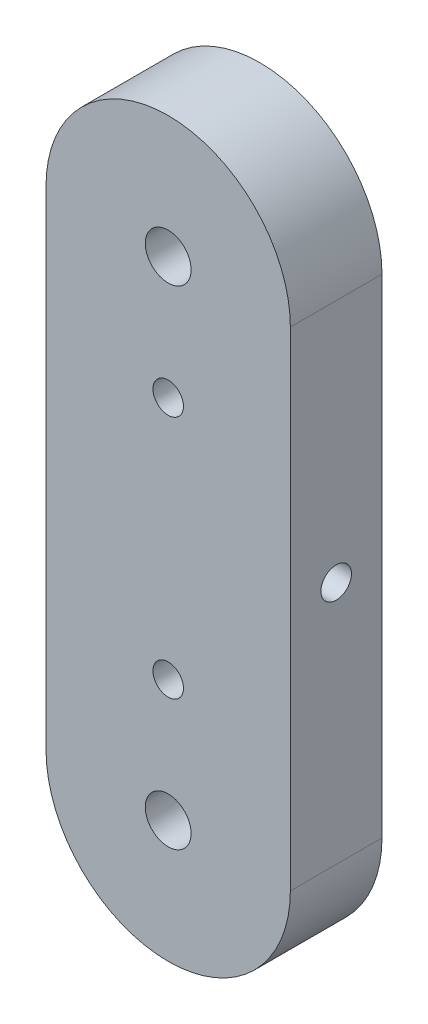
ISO-10303-21;
HEADER;
FILE_DESCRIPTION(('STEP AP214'),'2;1');
FILE_NAME('part.step','',(''),(''),'','','');
FILE_SCHEMA(('AUTOMOTIVE_DESIGN { 1 0 10303 214 1 1 1 1 }'));
ENDSEC;
DATA;
#1=APPLICATION_CONTEXT('core data for automotive mechanical design processes');
#2=APPLICATION_PROTOCOL_DEFINITION('international standard','automotive_design',2000,#1);
#3=PRODUCT_CONTEXT('',#1,'mechanical');
#4=PRODUCT('Part','Part','',(#3));
#5=PRODUCT_RELATED_PRODUCT_CATEGORY('part','',(#4));
#6=PRODUCT_DEFINITION_FORMATION('','',#4);
#7=PRODUCT_DEFINITION_CONTEXT('part definition',#1,'design');
#8=PRODUCT_DEFINITION('design','',#6,#7);
#9=PRODUCT_DEFINITION_SHAPE('','',#8);
#10=(LENGTH_UNIT() NAMED_UNIT(*) SI_UNIT(.MILLI.,.METRE.));
#11=(NAMED_UNIT(*) PLANE_ANGLE_UNIT() SI_UNIT($,.RADIAN.));
#12=(NAMED_UNIT(*) SI_UNIT($,.STERADIAN.) SOLID_ANGLE_UNIT());
#13=UNCERTAINTY_MEASURE_WITH_UNIT(LENGTH_MEASURE(1.E-05),#10,'distance_accuracy_value','');
#14=(GEOMETRIC_REPRESENTATION_CONTEXT(3) GLOBAL_UNCERTAINTY_ASSIGNED_CONTEXT((#13)) GLOBAL_UNIT_ASSIGNED_CONTEXT((#10,
#11,#12)) REPRESENTATION_CONTEXT('',''));
#15=CARTESIAN_POINT('',(0.,0.,0.));
#16=DIRECTION('',(0.,0.,1.));
#17=DIRECTION('',(1.,0.,0.));
#18=AXIS2_PLACEMENT_3D('',#15,#16,#17);
#19=CARTESIAN_POINT('',(50.8,0.,38.1));
#20=DIRECTION('',(0.,0.,-1.));
#21=DIRECTION('',(-1.,0.,0.));
#22=AXIS2_PLACEMENT_3D('',#19,#20,#21);
#23=CYLINDRICAL_SURFACE('',#22,50.8);
#24=CARTESIAN_POINT('',(50.8,0.,0.));
#25=DIRECTION('',(0.,0.,1.));
#26=DIRECTION('',(1.,0.,0.));
#27=AXIS2_PLACEMENT_3D('',#24,#25,#26);
#28=CIRCLE('',#27,50.8);
#29=CARTESIAN_POINT('',(0.,0.,0.));
#30=VERTEX_POINT('',#29);
#31=CARTESIAN_POINT('',(101.6,0.,0.));
#32=VERTEX_POINT('',#31);
#33=EDGE_CURVE('E106',#30,#32,#28,.T.);
#34=ORIENTED_EDGE('',*,*,#33,.T.);
#35=DIRECTION('',(0.,0.,-1.));
#36=VECTOR('',#35,1.);
#37=CARTESIAN_POINT('',(101.6,0.,38.1));
#38=LINE('',#37,#36);
#39=CARTESIAN_POINT('',(101.6,0.,38.1));
#40=VERTEX_POINT('',#39);
#41=EDGE_CURVE('E12',#40,#32,#38,.T.);
#42=ORIENTED_EDGE('',*,*,#41,.F.);
#43=CARTESIAN_POINT('',(50.8,0.,38.1));
#44=DIRECTION('',(0.,0.,1.));
#45=DIRECTION('',(1.,0.,0.));
#46=AXIS2_PLACEMENT_3D('',#43,#44,#45);
#47=CIRCLE('',#46,50.8);
#48=CARTESIAN_POINT('',(0.,0.,38.1));
#49=VERTEX_POINT('',#48);
#50=EDGE_CURVE('E94',#49,#40,#47,.T.);
#51=ORIENTED_EDGE('',*,*,#50,.F.);
#52=DIRECTION('',(0.,0.,-1.));
#53=VECTOR('',#52,1.);
#54=CARTESIAN_POINT('',(0.,0.,38.1));
#55=LINE('',#54,#53);
#56=EDGE_CURVE('E102',#49,#30,#55,.T.);
#57=ORIENTED_EDGE('',*,*,#56,.T.);
#58=EDGE_LOOP('',(#34,#42,#51,#57));
#59=FACE_BOUND('',#58,.T.);
#60=ADVANCED_FACE('F43',(#59),#23,.T.);
#61=CARTESIAN_POINT('',(101.6,203.013094366448,38.1));
#62=DIRECTION('',(-1.,0.,0.));
#63=DIRECTION('',(0.,-1.,0.));
#64=AXIS2_PLACEMENT_3D('',#61,#62,#63);
#65=PLANE('',#64);
#66=CARTESIAN_POINT('',(101.6,101.506547183224,19.05));
#67=DIRECTION('',(1.,0.,0.));
#68=DIRECTION('',(0.,1.,0.));
#69=AXIS2_PLACEMENT_3D('',#66,#67,#68);
#70=CIRCLE('',#69,6.35);
#71=CARTESIAN_POINT('',(101.6,107.856547183224,19.05));
#72=VERTEX_POINT('',#71);
#73=EDGE_CURVE('E120',#72,#72,#70,.T.);
#74=ORIENTED_EDGE('',*,*,#73,.F.);
#75=EDGE_LOOP('',(#74));
#76=FACE_BOUND('',#75,.T.);
#77=DIRECTION('',(0.,1.,0.));
#78=VECTOR('',#77,1.);
#79=CARTESIAN_POINT('',(101.6,203.013094366448,0.));
#80=LINE('',#79,#78);
#81=CARTESIAN_POINT('',(101.6,203.013094366448,0.));
#82=VERTEX_POINT('',#81);
#83=EDGE_CURVE('E98',#32,#82,#80,.T.);
#84=ORIENTED_EDGE('',*,*,#83,.T.);
#85=DIRECTION('',(0.,0.,-1.));
#86=VECTOR('',#85,1.);
#87=CARTESIAN_POINT('',(101.6,203.013094366448,38.1));
#88=LINE('',#87,#86);
#89=CARTESIAN_POINT('',(101.6,203.013094366448,38.1));
#90=VERTEX_POINT('',#89);
#91=EDGE_CURVE('E51',#90,#82,#88,.T.);
#92=ORIENTED_EDGE('',*,*,#91,.F.);
#93=DIRECTION('',(0.,1.,0.));
#94=VECTOR('',#93,1.);
#95=CARTESIAN_POINT('',(101.6,203.013094366448,38.1));
#96=LINE('',#95,#94);
#97=EDGE_CURVE('E89',#40,#90,#96,.T.);
#98=ORIENTED_EDGE('',*,*,#97,.F.);
#99=ORIENTED_EDGE('',*,*,#41,.T.);
#100=EDGE_LOOP('',(#84,#92,#98,#99));
#101=FACE_BOUND('',#100,.T.);
#102=ADVANCED_FACE('F97',(#76,#101),#65,.F.);
#103=CARTESIAN_POINT('',(50.8,203.013094366448,38.1));
#104=DIRECTION('',(0.,0.,-1.));
#105=DIRECTION('',(-1.,0.,0.));
#106=AXIS2_PLACEMENT_3D('',#103,#104,#105);
#107=CYLINDRICAL_SURFACE('',#106,50.8);
#108=CARTESIAN_POINT('',(50.8,203.013094366448,0.));
#109=DIRECTION('',(0.,0.,1.));
#110=DIRECTION('',(-1.,0.,0.));
#111=AXIS2_PLACEMENT_3D('',#108,#109,#110);
#112=CIRCLE('',#111,50.8);
#113=CARTESIAN_POINT('',(0.,203.013094366448,0.));
#114=VERTEX_POINT('',#113);
#115=EDGE_CURVE('E76',#82,#114,#112,.T.);
#116=ORIENTED_EDGE('',*,*,#115,.T.);
#117=DIRECTION('',(0.,0.,-1.));
#118=VECTOR('',#117,1.);
#119=CARTESIAN_POINT('',(0.,203.013094366448,38.1));
#120=LINE('',#119,#118);
#121=CARTESIAN_POINT('',(0.,203.013094366448,38.1));
#122=VERTEX_POINT('',#121);
#123=EDGE_CURVE('E99',#122,#114,#120,.T.);
#124=ORIENTED_EDGE('',*,*,#123,.F.);
#125=CARTESIAN_POINT('',(50.8,203.013094366448,38.1));
#126=DIRECTION('',(0.,0.,1.));
#127=DIRECTION('',(-1.,0.,0.));
#128=AXIS2_PLACEMENT_3D('',#125,#126,#127);
#129=CIRCLE('',#128,50.8);
#130=EDGE_CURVE('E92',#90,#122,#129,.T.);
#131=ORIENTED_EDGE('',*,*,#130,.F.);
#132=ORIENTED_EDGE('',*,*,#91,.T.);
#133=EDGE_LOOP('',(#116,#124,#131,#132));
#134=FACE_BOUND('',#133,.T.);
#135=ADVANCED_FACE('F100',(#134),#107,.T.);
#136=CARTESIAN_POINT('',(0.,0.,38.1));
#137=DIRECTION('',(1.,0.,0.));
#138=DIRECTION('',(0.,0.,-1.));
#139=AXIS2_PLACEMENT_3D('',#136,#137,#138);
#140=PLANE('',#139);
#141=CARTESIAN_POINT('',(0.,101.506547183224,19.05));
#142=DIRECTION('',(1.,0.,0.));
#143=DIRECTION('',(0.,1.,0.));
#144=AXIS2_PLACEMENT_3D('',#141,#142,#143);
#145=CIRCLE('',#144,6.35);
#146=CARTESIAN_POINT('',(0.,107.856547183224,19.05));
#147=VERTEX_POINT('',#146);
#148=EDGE_CURVE('E109',#147,#147,#145,.T.);
#149=ORIENTED_EDGE('',*,*,#148,.T.);
#150=EDGE_LOOP('',(#149));
#151=FACE_BOUND('',#150,.T.);
#152=DIRECTION('',(0.,-1.,0.));
#153=VECTOR('',#152,1.);
#154=CARTESIAN_POINT('',(0.,0.,0.));
#155=LINE('',#154,#153);
#156=EDGE_CURVE('E82',#114,#30,#155,.T.);
#157=ORIENTED_EDGE('',*,*,#156,.T.);
#158=ORIENTED_EDGE('',*,*,#56,.F.);
#159=DIRECTION('',(0.,-1.,0.));
#160=VECTOR('',#159,1.);
#161=CARTESIAN_POINT('',(0.,0.,38.1));
#162=LINE('',#161,#160);
#163=EDGE_CURVE('E59',#122,#49,#162,.T.);
#164=ORIENTED_EDGE('',*,*,#163,.F.);
#165=ORIENTED_EDGE('',*,*,#123,.T.);
#166=EDGE_LOOP('',(#157,#158,#164,#165));
#167=FACE_BOUND('',#166,.T.);
#168=ADVANCED_FACE('F114',(#151,#167),#140,.F.);
#169=CARTESIAN_POINT('',(50.8,0.,38.1));
#170=DIRECTION('',(0.,0.,1.));
#171=DIRECTION('',(1.,0.,0.));
#172=AXIS2_PLACEMENT_3D('',#169,#170,#171);
#173=PLANE('',#172);
#174=CARTESIAN_POINT('',(50.8,50.7065471832238,38.1));
#175=DIRECTION('',(0.,0.,1.));
#176=DIRECTION('',(1.,0.,0.));
#177=AXIS2_PLACEMENT_3D('',#174,#175,#176);
#178=CIRCLE('',#177,6.35);
#179=CARTESIAN_POINT('',(57.15,50.7065471832238,38.1));
#180=VERTEX_POINT('',#179);
#181=EDGE_CURVE('E141',#180,#180,#178,.T.);
#182=ORIENTED_EDGE('',*,*,#181,.F.);
#183=EDGE_LOOP('',(#182));
#184=FACE_BOUND('',#183,.T.);
#185=CARTESIAN_POINT('',(50.8,152.213094366448,38.1));
#186=DIRECTION('',(0.,0.,1.));
#187=DIRECTION('',(1.,0.,0.));
#188=AXIS2_PLACEMENT_3D('',#185,#186,#187);
#189=CIRCLE('',#188,6.35);
#190=CARTESIAN_POINT('',(57.15,152.213094366448,38.1));
#191=VERTEX_POINT('',#190);
#192=EDGE_CURVE('E138',#191,#191,#189,.T.);
#193=ORIENTED_EDGE('',*,*,#192,.F.);
#194=EDGE_LOOP('',(#193));
#195=FACE_BOUND('',#194,.T.);
#196=CARTESIAN_POINT('',(50.8,0.,38.1));
#197=DIRECTION('',(0.,0.,1.));
#198=DIRECTION('',(1.,0.,0.));
#199=AXIS2_PLACEMENT_3D('',#196,#197,#198);
#200=CIRCLE('',#199,9.525);
#201=CARTESIAN_POINT('',(60.325,0.,38.1));
#202=VERTEX_POINT('',#201);
#203=EDGE_CURVE('E131',#202,#202,#200,.T.);
#204=ORIENTED_EDGE('',*,*,#203,.F.);
#205=EDGE_LOOP('',(#204));
#206=FACE_BOUND('',#205,.T.);
#207=CARTESIAN_POINT('',(50.8,203.013094366448,38.1));
#208=DIRECTION('',(0.,0.,1.));
#209=DIRECTION('',(1.,0.,0.));
#210=AXIS2_PLACEMENT_3D('',#207,#208,#209);
#211=CIRCLE('',#210,9.525);
#212=CARTESIAN_POINT('',(60.325,203.013094366448,38.1));
#213=VERTEX_POINT('',#212);
#214=EDGE_CURVE('E123',#213,#213,#211,.T.);
#215=ORIENTED_EDGE('',*,*,#214,.F.);
#216=EDGE_LOOP('',(#215));
#217=FACE_BOUND('',#216,.T.);
#218=ORIENTED_EDGE('',*,*,#50,.T.);
#219=ORIENTED_EDGE('',*,*,#97,.T.);
#220=ORIENTED_EDGE('',*,*,#130,.T.);
#221=ORIENTED_EDGE('',*,*,#163,.T.);
#222=EDGE_LOOP('',(#218,#219,#220,#221));
#223=FACE_BOUND('',#222,.T.);
#224=ADVANCED_FACE('F90',(#184,#195,#206,#217,#223),#173,.T.);
#225=CARTESIAN_POINT('',(50.8,0.,0.));
#226=DIRECTION('',(0.,0.,1.));
#227=DIRECTION('',(1.,0.,0.));
#228=AXIS2_PLACEMENT_3D('',#225,#226,#227);
#229=PLANE('',#228);
#230=CARTESIAN_POINT('',(50.8,0.,0.));
#231=DIRECTION('',(0.,0.,1.));
#232=DIRECTION('',(1.,0.,0.));
#233=AXIS2_PLACEMENT_3D('',#230,#231,#232);
#234=CIRCLE('',#233,9.525);
#235=CARTESIAN_POINT('',(60.325,0.,0.));
#236=VERTEX_POINT('',#235);
#237=EDGE_CURVE('E134',#236,#236,#234,.T.);
#238=ORIENTED_EDGE('',*,*,#237,.T.);
#239=EDGE_LOOP('',(#238));
#240=FACE_BOUND('',#239,.T.);
#241=CARTESIAN_POINT('',(50.8,203.013094366448,0.));
#242=DIRECTION('',(0.,0.,1.));
#243=DIRECTION('',(1.,0.,0.));
#244=AXIS2_PLACEMENT_3D('',#241,#242,#243);
#245=CIRCLE('',#244,9.525);
#246=CARTESIAN_POINT('',(60.325,203.013094366448,0.));
#247=VERTEX_POINT('',#246);
#248=EDGE_CURVE('E128',#247,#247,#245,.T.);
#249=ORIENTED_EDGE('',*,*,#248,.T.);
#250=EDGE_LOOP('',(#249));
#251=FACE_BOUND('',#250,.T.);
#252=ORIENTED_EDGE('',*,*,#33,.F.);
#253=ORIENTED_EDGE('',*,*,#156,.F.);
#254=ORIENTED_EDGE('',*,*,#115,.F.);
#255=ORIENTED_EDGE('',*,*,#83,.F.);
#256=EDGE_LOOP('',(#252,#253,#254,#255));
#257=FACE_BOUND('',#256,.T.);
#258=ADVANCED_FACE('F117',(#240,#251,#257),#229,.F.);
#259=CARTESIAN_POINT('',(0.,101.506547183224,19.05));
#260=DIRECTION('',(1.,0.,0.));
#261=DIRECTION('',(0.,1.,0.));
#262=AXIS2_PLACEMENT_3D('',#259,#260,#261);
#263=CYLINDRICAL_SURFACE('',#262,6.35);
#264=CARTESIAN_POINT('',(0.,107.856547183224,19.05));
#265=CARTESIAN_POINT('',(1.05833333333328,107.856547183224,19.05));
#266=CARTESIAN_POINT('',(2.11666666666661,107.856547183224,19.05));
#267=CARTESIAN_POINT('',(4.23333333333328,107.856547183224,19.05));
#268=CARTESIAN_POINT('',(5.29166666666661,107.856547183224,19.05));
#269=CARTESIAN_POINT('',(7.40833333333328,107.856547183224,19.05));
#270=CARTESIAN_POINT('',(8.46666666666661,107.856547183224,19.05));
#271=CARTESIAN_POINT('',(10.5833333333333,107.856547183224,19.05));
#272=CARTESIAN_POINT('',(11.6416666666666,107.856547183224,19.05));
#273=CARTESIAN_POINT('',(13.7583333333333,107.856547183224,19.05));
#274=CARTESIAN_POINT('',(14.8166666666666,107.856547183224,19.05));
#275=CARTESIAN_POINT('',(16.9333333333333,107.856547183224,19.05));
#276=CARTESIAN_POINT('',(17.9916666666666,107.856547183224,19.05));
#277=CARTESIAN_POINT('',(20.1083333333333,107.856547183224,19.05));
#278=CARTESIAN_POINT('',(21.1666666666666,107.856547183224,19.05));
#279=CARTESIAN_POINT('',(23.2833333333333,107.856547183224,19.05));
#280=CARTESIAN_POINT('',(24.3416666666666,107.856547183224,19.05));
#281=CARTESIAN_POINT('',(26.4583333333333,107.856547183224,19.05));
#282=CARTESIAN_POINT('',(27.5166666666666,107.856547183224,19.05));
#283=CARTESIAN_POINT('',(29.6333333333333,107.856547183224,19.05));
#284=CARTESIAN_POINT('',(30.6916666666666,107.856547183224,19.05));
#285=CARTESIAN_POINT('',(32.8083333333333,107.856547183224,19.05));
#286=CARTESIAN_POINT('',(33.8666666666666,107.856547183224,19.05));
#287=CARTESIAN_POINT('',(35.9833333333333,107.856547183224,19.05));
#288=CARTESIAN_POINT('',(37.0416666666666,107.856547183224,19.05));
#289=CARTESIAN_POINT('',(39.1583333333333,107.856547183224,19.05));
#290=CARTESIAN_POINT('',(40.2166666666666,107.856547183224,19.05));
#291=CARTESIAN_POINT('',(42.3333333333333,107.856547183224,19.05));
#292=CARTESIAN_POINT('',(43.3916666666666,107.856547183224,19.05));
#293=CARTESIAN_POINT('',(45.5083333333333,107.856547183224,19.05));
#294=CARTESIAN_POINT('',(46.5666666666666,107.856547183224,19.05));
#295=CARTESIAN_POINT('',(48.6833333333333,107.856547183224,19.05));
#296=CARTESIAN_POINT('',(49.7416666666666,107.856547183224,19.05));
#297=CARTESIAN_POINT('',(51.8583333333333,107.856547183224,19.05));
#298=CARTESIAN_POINT('',(52.9166666666666,107.856547183224,19.05));
#299=CARTESIAN_POINT('',(55.0333333333333,107.856547183224,19.05));
#300=CARTESIAN_POINT('',(56.0916666666666,107.856547183224,19.05));
#301=CARTESIAN_POINT('',(58.2083333333333,107.856547183224,19.05));
#302=CARTESIAN_POINT('',(59.2666666666666,107.856547183224,19.05));
#303=CARTESIAN_POINT('',(61.3833333333333,107.856547183224,19.05));
#304=CARTESIAN_POINT('',(62.4416666666666,107.856547183224,19.05));
#305=CARTESIAN_POINT('',(64.5583333333333,107.856547183224,19.05));
#306=CARTESIAN_POINT('',(65.6166666666666,107.856547183224,19.05));
#307=CARTESIAN_POINT('',(67.7333333333333,107.856547183224,19.05));
#308=CARTESIAN_POINT('',(68.7916666666666,107.856547183224,19.05));
#309=CARTESIAN_POINT('',(70.9083333333333,107.856547183224,19.05));
#310=CARTESIAN_POINT('',(71.9666666666666,107.856547183224,19.05));
#311=CARTESIAN_POINT('',(74.0833333333333,107.856547183224,19.05));
#312=CARTESIAN_POINT('',(75.1416666666666,107.856547183224,19.05));
#313=CARTESIAN_POINT('',(77.2583333333333,107.856547183224,19.05));
#314=CARTESIAN_POINT('',(78.3166666666666,107.856547183224,19.05));
#315=CARTESIAN_POINT('',(80.4333333333333,107.856547183224,19.05));
#316=CARTESIAN_POINT('',(81.4916666666666,107.856547183224,19.05));
#317=CARTESIAN_POINT('',(83.6083333333333,107.856547183224,19.05));
#318=CARTESIAN_POINT('',(84.6666666666666,107.856547183224,19.05));
#319=CARTESIAN_POINT('',(86.7833333333333,107.856547183224,19.05));
#320=CARTESIAN_POINT('',(87.8416666666666,107.856547183224,19.05));
#321=CARTESIAN_POINT('',(89.9583333333333,107.856547183224,19.05));
#322=CARTESIAN_POINT('',(91.0166666666666,107.856547183224,19.05));
#323=CARTESIAN_POINT('',(93.1333333333333,107.856547183224,19.05));
#324=CARTESIAN_POINT('',(94.1916666666666,107.856547183224,19.05));
#325=CARTESIAN_POINT('',(96.3083333333333,107.856547183224,19.05));
#326=CARTESIAN_POINT('',(97.3666666666666,107.856547183224,19.05));
#327=CARTESIAN_POINT('',(99.4833333333333,107.856547183224,19.05));
#328=CARTESIAN_POINT('',(100.541666666667,107.856547183224,19.05));
#329=CARTESIAN_POINT('',(101.6,107.856547183224,19.05));
#330=B_SPLINE_CURVE_WITH_KNOTS('',3,(#264,#265,#266,#267,#268,#269,#270,#271,#272,#273,#274,
#275,#276,#277,#278,#279,#280,#281,#282,#283,#284,#285,#286,#287,#288,#289,#290,#291,#292,#293,
#294,#295,#296,#297,#298,#299,#300,#301,#302,#303,#304,#305,#306,#307,#308,#309,#310,#311,#312,
#313,#314,#315,#316,#317,#318,#319,#320,#321,#322,#323,#324,#325,#326,#327,#328,#329),
.UNSPECIFIED.,.F.,.F.,(4,2,2,2,2,2,2,2,2,2,2,2,2,2,2,2,2,2,2,2,2,2,2,2,2,2,2,2,2,2,2,2,4),(0.,
3.175,6.35,9.525,12.7,15.875,19.05,22.225,25.4,28.575,31.75,34.925,38.1,41.275,44.45,47.625,
50.8,53.975,57.15,60.325,63.5,66.675,69.85,73.025,76.2,79.375,82.55,85.725,88.9,92.075,95.25,
98.425,101.6),.UNSPECIFIED.);
#331=EDGE_CURVE('BSEAM164',#147,#72,#330,.T.);
#332=ORIENTED_EDGE('',*,*,#148,.F.);
#333=ORIENTED_EDGE('',*,*,#73,.T.);
#334=ORIENTED_EDGE('',*,*,#331,.T.);
#335=ORIENTED_EDGE('',*,*,#331,.F.);
#336=EDGE_LOOP('',(#332,#334,#333,#335));
#337=FACE_BOUND('',#336,.T.);
#338=ADVANCED_FACE('F164',(#337),#263,.F.);
#339=CARTESIAN_POINT('',(50.8,203.013094366448,38.1));
#340=DIRECTION('',(0.,0.,1.));
#341=DIRECTION('',(1.,0.,0.));
#342=AXIS2_PLACEMENT_3D('',#339,#340,#341);
#343=CYLINDRICAL_SURFACE('',#342,9.525);
#344=ORIENTED_EDGE('',*,*,#248,.F.);
#345=EDGE_LOOP('',(#344));
#346=FACE_BOUND('',#345,.T.);
#347=ORIENTED_EDGE('',*,*,#214,.T.);
#348=EDGE_LOOP('',(#347));
#349=FACE_BOUND('',#348,.T.);
#350=ADVANCED_FACE('F161',(#346,#349),#343,.F.);
#351=CARTESIAN_POINT('',(50.8,0.,38.1));
#352=DIRECTION('',(0.,0.,1.));
#353=DIRECTION('',(1.,0.,0.));
#354=AXIS2_PLACEMENT_3D('',#351,#352,#353);
#355=CYLINDRICAL_SURFACE('',#354,9.525);
#356=ORIENTED_EDGE('',*,*,#237,.F.);
#357=EDGE_LOOP('',(#356));
#358=FACE_BOUND('',#357,.T.);
#359=ORIENTED_EDGE('',*,*,#203,.T.);
#360=EDGE_LOOP('',(#359));
#361=FACE_BOUND('',#360,.T.);
#362=ADVANCED_FACE('F163',(#358,#361),#355,.F.);
#363=CARTESIAN_POINT('',(50.8,152.213094366448,-17.9605122421383));
#364=DIRECTION('',(0.,0.,1.));
#365=DIRECTION('',(1.,0.,0.));
#366=AXIS2_PLACEMENT_3D('',#363,#364,#365);
#367=CYLINDRICAL_SURFACE('',#366,6.35);
#368=CARTESIAN_POINT('',(50.8,152.213094366448,2.54));
#369=DIRECTION('',(0.,0.,1.));
#370=DIRECTION('',(1.,0.,0.));
#371=AXIS2_PLACEMENT_3D('',#368,#369,#370);
#372=CIRCLE('',#371,6.35);
#373=CARTESIAN_POINT('',(57.15,152.213094366448,2.54));
#374=VERTEX_POINT('',#373);
#375=EDGE_CURVE('E142',#374,#374,#372,.F.);
#376=ORIENTED_EDGE('',*,*,#375,.T.);
#377=EDGE_LOOP('',(#376));
#378=FACE_BOUND('',#377,.T.);
#379=ORIENTED_EDGE('',*,*,#192,.T.);
#380=EDGE_LOOP('',(#379));
#381=FACE_BOUND('',#380,.T.);
#382=ADVANCED_FACE('F171',(#378,#381),#367,.F.);
#383=CARTESIAN_POINT('',(50.8,0.,2.54));
#384=DIRECTION('',(0.,0.,1.));
#385=DIRECTION('',(1.,0.,0.));
#386=AXIS2_PLACEMENT_3D('',#383,#384,#385);
#387=PLANE('',#386);
#388=ORIENTED_EDGE('',*,*,#375,.F.);
#389=EDGE_LOOP('',(#388));
#390=FACE_BOUND('',#389,.T.);
#391=ADVANCED_FACE('F263',(#390),#387,.T.);
#392=CARTESIAN_POINT('',(50.8,50.7065471832238,-17.9605122421383));
#393=DIRECTION('',(0.,0.,1.));
#394=DIRECTION('',(1.,0.,0.));
#395=AXIS2_PLACEMENT_3D('',#392,#393,#394);
#396=CYLINDRICAL_SURFACE('',#395,6.35);
#397=CARTESIAN_POINT('',(50.8,50.7065471832238,2.54));
#398=DIRECTION('',(0.,0.,1.));
#399=DIRECTION('',(1.,0.,0.));
#400=AXIS2_PLACEMENT_3D('',#397,#398,#399);
#401=CIRCLE('',#400,6.35);
#402=CARTESIAN_POINT('',(57.15,50.7065471832238,2.54));
#403=VERTEX_POINT('',#402);
#404=EDGE_CURVE('E137',#403,#403,#401,.F.);
#405=ORIENTED_EDGE('',*,*,#404,.T.);
#406=EDGE_LOOP('',(#405));
#407=FACE_BOUND('',#406,.T.);
#408=ORIENTED_EDGE('',*,*,#181,.T.);
#409=EDGE_LOOP('',(#408));
#410=FACE_BOUND('',#409,.T.);
#411=ADVANCED_FACE('F150',(#407,#410),#396,.F.);
#412=CARTESIAN_POINT('',(50.8,0.,2.54));
#413=DIRECTION('',(0.,0.,1.));
#414=DIRECTION('',(1.,0.,0.));
#415=AXIS2_PLACEMENT_3D('',#412,#413,#414);
#416=PLANE('',#415);
#417=ORIENTED_EDGE('',*,*,#404,.F.);
#418=EDGE_LOOP('',(#417));
#419=FACE_BOUND('',#418,.T.);
#420=ADVANCED_FACE('F282',(#419),#416,.T.);
#421=CLOSED_SHELL('',(#60,#102,#135,#168,#224,#258,#338,#350,#362,#382,#391,#411,#420));
#422=MANIFOLD_SOLID_BREP('B2',#421);
#423=ADVANCED_BREP_SHAPE_REPRESENTATION('',(#18,#422),#14);
#424=SHAPE_DEFINITION_REPRESENTATION(#9,#423);
ENDSEC;
END-ISO-10303-21;
